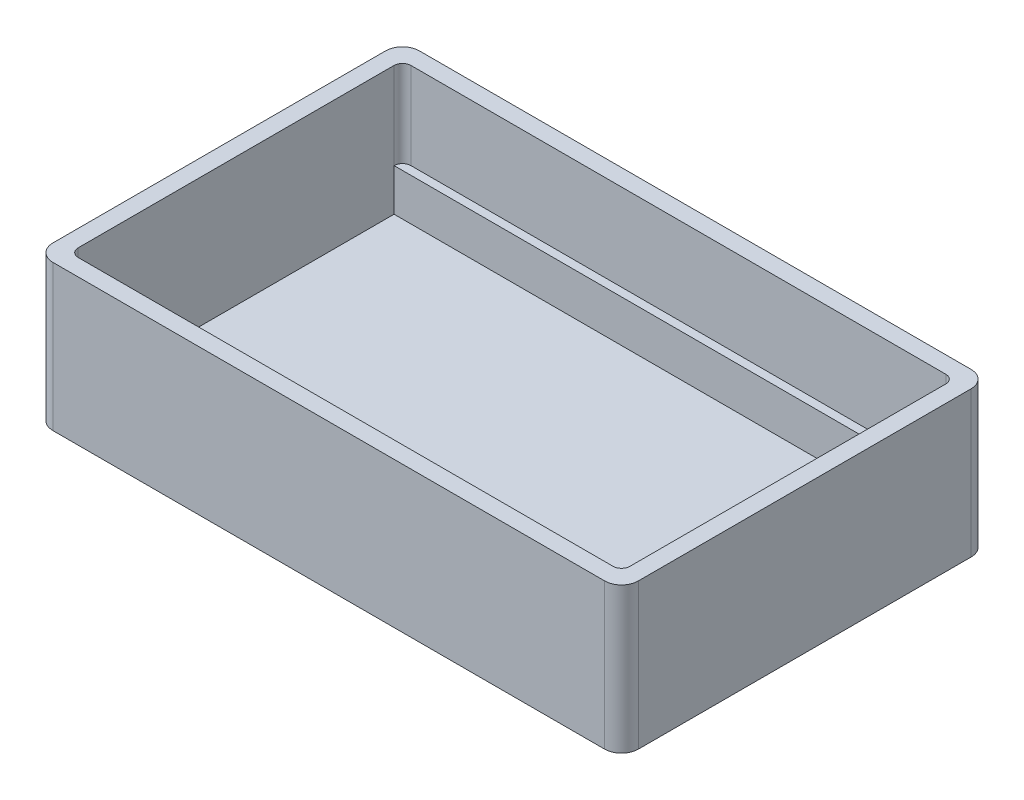
ISO-10303-21;
HEADER;
FILE_DESCRIPTION(('STEP AP214'),'2;1');
FILE_NAME('part.step','',(''),(''),'','','');
FILE_SCHEMA(('AUTOMOTIVE_DESIGN { 1 0 10303 214 1 1 1 1 }'));
ENDSEC;
DATA;
#1=APPLICATION_CONTEXT('core data for automotive mechanical design processes');
#2=APPLICATION_PROTOCOL_DEFINITION('international standard','automotive_design',2000,#1);
#3=PRODUCT_CONTEXT('',#1,'mechanical');
#4=PRODUCT('Part','Part','',(#3));
#5=PRODUCT_RELATED_PRODUCT_CATEGORY('part','',(#4));
#6=PRODUCT_DEFINITION_FORMATION('','',#4);
#7=PRODUCT_DEFINITION_CONTEXT('part definition',#1,'design');
#8=PRODUCT_DEFINITION('design','',#6,#7);
#9=PRODUCT_DEFINITION_SHAPE('','',#8);
#10=(LENGTH_UNIT() NAMED_UNIT(*) SI_UNIT(.MILLI.,.METRE.));
#11=(NAMED_UNIT(*) PLANE_ANGLE_UNIT() SI_UNIT($,.RADIAN.));
#12=(NAMED_UNIT(*) SI_UNIT($,.STERADIAN.) SOLID_ANGLE_UNIT());
#13=UNCERTAINTY_MEASURE_WITH_UNIT(LENGTH_MEASURE(1.E-05),#10,'distance_accuracy_value','');
#14=(GEOMETRIC_REPRESENTATION_CONTEXT(3) GLOBAL_UNCERTAINTY_ASSIGNED_CONTEXT((#13)) GLOBAL_UNIT_ASSIGNED_CONTEXT((#10,
#11,#12)) REPRESENTATION_CONTEXT('',''));
#15=CARTESIAN_POINT('',(0.,0.,0.));
#16=DIRECTION('',(0.,0.,1.));
#17=DIRECTION('',(1.,0.,0.));
#18=AXIS2_PLACEMENT_3D('',#15,#16,#17);
#19=CARTESIAN_POINT('',(92.4170933390066,17.3,19.8786194386804));
#20=DIRECTION('',(1.,0.,0.));
#21=DIRECTION('',(0.,0.,-1.));
#22=AXIS2_PLACEMENT_3D('',#19,#20,#21);
#23=PLANE('',#22);
#24=DIRECTION('',(0.,-1.,0.));
#25=VECTOR('',#24,1.);
#26=CARTESIAN_POINT('',(92.4170933390066,2.,-18.6213805613196));
#27=LINE('',#26,#25);
#28=CARTESIAN_POINT('',(92.4170933390066,17.3,-18.6213805613196));
#29=VERTEX_POINT('',#28);
#30=CARTESIAN_POINT('',(92.4170933390066,7.,-18.6213805613196));
#31=VERTEX_POINT('',#30);
#32=EDGE_CURVE('E232',#29,#31,#27,.T.);
#33=ORIENTED_EDGE('',*,*,#32,.T.);
#34=DIRECTION('',(0.,0.,-1.));
#35=VECTOR('',#34,1.);
#36=CARTESIAN_POINT('',(92.4170933390066,7.,0.));
#37=LINE('',#36,#35);
#38=CARTESIAN_POINT('',(92.4170933390066,7.,18.8786194386804));
#39=VERTEX_POINT('',#38);
#40=EDGE_CURVE('E340',#39,#31,#37,.T.);
#41=ORIENTED_EDGE('',*,*,#40,.F.);
#42=DIRECTION('',(0.,-1.,0.));
#43=VECTOR('',#42,1.);
#44=CARTESIAN_POINT('',(92.4170933390066,17.3,18.8786194386804));
#45=LINE('',#44,#43);
#46=CARTESIAN_POINT('',(92.4170933390066,17.3,18.8786194386804));
#47=VERTEX_POINT('',#46);
#48=EDGE_CURVE('E242',#39,#47,#45,.F.);
#49=ORIENTED_EDGE('',*,*,#48,.T.);
#50=DIRECTION('',(0.,0.,1.));
#51=VECTOR('',#50,1.);
#52=CARTESIAN_POINT('',(92.4170933390066,17.3,19.8786194386804));
#53=LINE('',#52,#51);
#54=EDGE_CURVE('E318',#29,#47,#53,.T.);
#55=ORIENTED_EDGE('',*,*,#54,.F.);
#56=EDGE_LOOP('',(#33,#41,#49,#55));
#57=FACE_BOUND('',#56,.T.);
#58=ADVANCED_FACE('F45',(#57),#23,.F.);
#59=CARTESIAN_POINT('',(92.4170933390066,17.3,-19.6213805613196));
#60=DIRECTION('',(0.,0.,-1.));
#61=DIRECTION('',(-1.,0.,0.));
#62=AXIS2_PLACEMENT_3D('',#59,#60,#61);
#63=PLANE('',#62);
#64=DIRECTION('',(0.,-1.,0.));
#65=VECTOR('',#64,1.);
#66=CARTESIAN_POINT('',(27.9170933390065,2.,-19.6213805613196));
#67=LINE('',#66,#65);
#68=CARTESIAN_POINT('',(27.9170933390065,17.3,-19.6213805613196));
#69=VERTEX_POINT('',#68);
#70=CARTESIAN_POINT('',(27.9170933390065,7.,-19.6213805613196));
#71=VERTEX_POINT('',#70);
#72=EDGE_CURVE('E223',#69,#71,#67,.T.);
#73=ORIENTED_EDGE('',*,*,#72,.T.);
#74=DIRECTION('',(-1.,0.,0.));
#75=VECTOR('',#74,1.);
#76=CARTESIAN_POINT('',(0.,7.,-19.6213805613196));
#77=LINE('',#76,#75);
#78=CARTESIAN_POINT('',(91.4170933390066,7.,-19.6213805613196));
#79=VERTEX_POINT('',#78);
#80=EDGE_CURVE('E336',#79,#71,#77,.T.);
#81=ORIENTED_EDGE('',*,*,#80,.F.);
#82=DIRECTION('',(0.,-1.,0.));
#83=VECTOR('',#82,1.);
#84=CARTESIAN_POINT('',(91.4170933390066,17.3,-19.6213805613196));
#85=LINE('',#84,#83);
#86=CARTESIAN_POINT('',(91.4170933390066,17.3,-19.6213805613196));
#87=VERTEX_POINT('',#86);
#88=EDGE_CURVE('E235',#79,#87,#85,.F.);
#89=ORIENTED_EDGE('',*,*,#88,.T.);
#90=DIRECTION('',(1.,0.,0.));
#91=VECTOR('',#90,1.);
#92=CARTESIAN_POINT('',(92.4170933390066,17.3,-19.6213805613196));
#93=LINE('',#92,#91);
#94=EDGE_CURVE('E307',#69,#87,#93,.T.);
#95=ORIENTED_EDGE('',*,*,#94,.F.);
#96=EDGE_LOOP('',(#73,#81,#89,#95));
#97=FACE_BOUND('',#96,.T.);
#98=ADVANCED_FACE('F366',(#97),#63,.F.);
#99=CARTESIAN_POINT('',(26.9170933390065,17.3,19.8786194386804));
#100=DIRECTION('',(-1.,0.,0.));
#101=DIRECTION('',(0.,0.,1.));
#102=AXIS2_PLACEMENT_3D('',#99,#100,#101);
#103=PLANE('',#102);
#104=DIRECTION('',(0.,0.,1.));
#105=VECTOR('',#104,1.);
#106=CARTESIAN_POINT('',(26.9170933390065,2.,19.8786194386804));
#107=LINE('',#106,#105);
#108=CARTESIAN_POINT('',(26.9170933390065,2.,-18.6213805613196));
#109=VERTEX_POINT('',#108);
#110=CARTESIAN_POINT('',(26.9170933390065,2.,18.8786194386804));
#111=VERTEX_POINT('',#110);
#112=EDGE_CURVE('E189',#109,#111,#107,.T.);
#113=ORIENTED_EDGE('',*,*,#112,.F.);
#114=DIRECTION('',(0.,-1.,0.));
#115=VECTOR('',#114,1.);
#116=CARTESIAN_POINT('',(26.9170933390065,17.3,-18.6213805613196));
#117=LINE('',#116,#115);
#118=CARTESIAN_POINT('',(26.9170933390065,7.,-18.6213805613196));
#119=VERTEX_POINT('',#118);
#120=EDGE_CURVE('E227',#109,#119,#117,.F.);
#121=ORIENTED_EDGE('',*,*,#120,.T.);
#122=CARTESIAN_POINT('',(26.9170933390065,17.3,-18.6213805613196));
#123=VERTEX_POINT('',#122);
#124=EDGE_CURVE('E226',#119,#123,#117,.F.);
#125=ORIENTED_EDGE('',*,*,#124,.T.);
#126=DIRECTION('',(0.,0.,-1.));
#127=VECTOR('',#126,1.);
#128=CARTESIAN_POINT('',(26.9170933390065,17.3,19.8786194386804));
#129=LINE('',#128,#127);
#130=CARTESIAN_POINT('',(26.9170933390065,17.3,18.8786194386804));
#131=VERTEX_POINT('',#130);
#132=EDGE_CURVE('E210',#131,#123,#129,.T.);
#133=ORIENTED_EDGE('',*,*,#132,.F.);
#134=DIRECTION('',(0.,-1.,0.));
#135=VECTOR('',#134,1.);
#136=CARTESIAN_POINT('',(26.9170933390065,2.,18.8786194386804));
#137=LINE('',#136,#135);
#138=CARTESIAN_POINT('',(26.9170933390065,7.,18.8786194386804));
#139=VERTEX_POINT('',#138);
#140=EDGE_CURVE('E204',#131,#139,#137,.T.);
#141=ORIENTED_EDGE('',*,*,#140,.T.);
#142=DIRECTION('',(0.,-1.,0.));
#143=VECTOR('',#142,1.);
#144=CARTESIAN_POINT('',(26.9170933390065,7.,18.8786194386804));
#145=LINE('',#144,#143);
#146=EDGE_CURVE('E178',#139,#111,#145,.T.);
#147=ORIENTED_EDGE('',*,*,#146,.T.);
#148=EDGE_LOOP('',(#113,#121,#125,#133,#141,#147));
#149=FACE_BOUND('',#148,.T.);
#150=ADVANCED_FACE('F208',(#149),#103,.F.);
#151=CARTESIAN_POINT('',(92.4170933390066,17.3,19.8786194386804));
#152=DIRECTION('',(0.,0.,1.));
#153=DIRECTION('',(1.,0.,0.));
#154=AXIS2_PLACEMENT_3D('',#151,#152,#153);
#155=PLANE('',#154);
#156=DIRECTION('',(0.,-1.,0.));
#157=VECTOR('',#156,1.);
#158=CARTESIAN_POINT('',(91.4170933390066,2.,19.8786194386804));
#159=LINE('',#158,#157);
#160=CARTESIAN_POINT('',(91.4170933390066,17.3,19.8786194386804));
#161=VERTEX_POINT('',#160);
#162=CARTESIAN_POINT('',(91.4170933390066,7.,19.8786194386804));
#163=VERTEX_POINT('',#162);
#164=EDGE_CURVE('E239',#161,#163,#159,.T.);
#165=ORIENTED_EDGE('',*,*,#164,.T.);
#166=DIRECTION('',(1.,0.,0.));
#167=VECTOR('',#166,1.);
#168=CARTESIAN_POINT('',(0.,7.,19.8786194386804));
#169=LINE('',#168,#167);
#170=CARTESIAN_POINT('',(27.9170933390065,7.,19.8786194386804));
#171=VERTEX_POINT('',#170);
#172=EDGE_CURVE('E60',#171,#163,#169,.T.);
#173=ORIENTED_EDGE('',*,*,#172,.F.);
#174=DIRECTION('',(0.,-1.,0.));
#175=VECTOR('',#174,1.);
#176=CARTESIAN_POINT('',(27.9170933390065,17.3,19.8786194386804));
#177=LINE('',#176,#175);
#178=CARTESIAN_POINT('',(27.9170933390065,17.3,19.8786194386804));
#179=VERTEX_POINT('',#178);
#180=EDGE_CURVE('E205',#171,#179,#177,.F.);
#181=ORIENTED_EDGE('',*,*,#180,.T.);
#182=DIRECTION('',(-1.,0.,0.));
#183=VECTOR('',#182,1.);
#184=CARTESIAN_POINT('',(92.4170933390066,17.3,19.8786194386804));
#185=LINE('',#184,#183);
#186=EDGE_CURVE('E315',#161,#179,#185,.T.);
#187=ORIENTED_EDGE('',*,*,#186,.F.);
#188=EDGE_LOOP('',(#165,#173,#181,#187));
#189=FACE_BOUND('',#188,.T.);
#190=ADVANCED_FACE('F357',(#189),#155,.F.);
#191=CARTESIAN_POINT('',(94.4170933390066,17.3,21.8786194386804));
#192=DIRECTION('',(0.,0.,1.));
#193=DIRECTION('',(1.,0.,0.));
#194=AXIS2_PLACEMENT_3D('',#191,#192,#193);
#195=PLANE('',#194);
#196=DIRECTION('',(-1.,0.,0.));
#197=VECTOR('',#196,1.);
#198=CARTESIAN_POINT('',(94.4170933390066,17.3,21.8786194386804));
#199=LINE('',#198,#197);
#200=CARTESIAN_POINT('',(92.4170933390066,17.3,21.8786194386804));
#201=VERTEX_POINT('',#200);
#202=CARTESIAN_POINT('',(26.9170933390065,17.3,21.8786194386804));
#203=VERTEX_POINT('',#202);
#204=EDGE_CURVE('E281',#201,#203,#199,.T.);
#205=ORIENTED_EDGE('',*,*,#204,.T.);
#206=DIRECTION('',(0.,-1.,0.));
#207=VECTOR('',#206,1.);
#208=CARTESIAN_POINT('',(26.9170933390065,17.3,21.8786194386804));
#209=LINE('',#208,#207);
#210=CARTESIAN_POINT('',(26.9170933390065,0.,21.8786194386804));
#211=VERTEX_POINT('',#210);
#212=EDGE_CURVE('E11',#203,#211,#209,.T.);
#213=ORIENTED_EDGE('',*,*,#212,.T.);
#214=DIRECTION('',(-1.,0.,0.));
#215=VECTOR('',#214,1.);
#216=CARTESIAN_POINT('',(94.4170933390066,0.,21.8786194386804));
#217=LINE('',#216,#215);
#218=CARTESIAN_POINT('',(92.4170933390066,0.,21.8786194386804));
#219=VERTEX_POINT('',#218);
#220=EDGE_CURVE('E284',#219,#211,#217,.T.);
#221=ORIENTED_EDGE('',*,*,#220,.F.);
#222=DIRECTION('',(0.,-1.,0.));
#223=VECTOR('',#222,1.);
#224=CARTESIAN_POINT('',(92.4170933390066,17.3,21.8786194386804));
#225=LINE('',#224,#223);
#226=EDGE_CURVE('E53',#219,#201,#225,.F.);
#227=ORIENTED_EDGE('',*,*,#226,.T.);
#228=EDGE_LOOP('',(#205,#213,#221,#227));
#229=FACE_BOUND('',#228,.T.);
#230=ADVANCED_FACE('F280',(#229),#195,.T.);
#231=CARTESIAN_POINT('',(94.4170933390066,17.3,21.8786194386804));
#232=DIRECTION('',(1.,0.,0.));
#233=DIRECTION('',(0.,0.,-1.));
#234=AXIS2_PLACEMENT_3D('',#231,#232,#233);
#235=PLANE('',#234);
#236=DIRECTION('',(0.,0.,1.));
#237=VECTOR('',#236,1.);
#238=CARTESIAN_POINT('',(94.4170933390066,0.,21.8786194386804));
#239=LINE('',#238,#237);
#240=CARTESIAN_POINT('',(94.4170933390066,0.,-19.6213805613196));
#241=VERTEX_POINT('',#240);
#242=CARTESIAN_POINT('',(94.4170933390066,0.,19.8786194386804));
#243=VERTEX_POINT('',#242);
#244=EDGE_CURVE('E219',#241,#243,#239,.T.);
#245=ORIENTED_EDGE('',*,*,#244,.F.);
#246=DIRECTION('',(0.,-1.,0.));
#247=VECTOR('',#246,1.);
#248=CARTESIAN_POINT('',(94.4170933390066,17.3,-19.6213805613196));
#249=LINE('',#248,#247);
#250=CARTESIAN_POINT('',(94.4170933390066,17.3,-19.6213805613196));
#251=VERTEX_POINT('',#250);
#252=EDGE_CURVE('E262',#241,#251,#249,.F.);
#253=ORIENTED_EDGE('',*,*,#252,.T.);
#254=DIRECTION('',(0.,0.,1.));
#255=VECTOR('',#254,1.);
#256=CARTESIAN_POINT('',(94.4170933390066,17.3,21.8786194386804));
#257=LINE('',#256,#255);
#258=CARTESIAN_POINT('',(94.4170933390066,17.3,19.8786194386804));
#259=VERTEX_POINT('',#258);
#260=EDGE_CURVE('E211',#251,#259,#257,.T.);
#261=ORIENTED_EDGE('',*,*,#260,.T.);
#262=DIRECTION('',(0.,-1.,0.));
#263=VECTOR('',#262,1.);
#264=CARTESIAN_POINT('',(94.4170933390066,17.3,19.8786194386804));
#265=LINE('',#264,#263);
#266=EDGE_CURVE('E259',#259,#243,#265,.T.);
#267=ORIENTED_EDGE('',*,*,#266,.T.);
#268=EDGE_LOOP('',(#245,#253,#261,#267));
#269=FACE_BOUND('',#268,.T.);
#270=ADVANCED_FACE('F296',(#269),#235,.T.);
#271=CARTESIAN_POINT('',(94.4170933390066,17.3,-21.6213805613196));
#272=DIRECTION('',(0.,0.,-1.));
#273=DIRECTION('',(-1.,0.,0.));
#274=AXIS2_PLACEMENT_3D('',#271,#272,#273);
#275=PLANE('',#274);
#276=DIRECTION('',(1.,0.,0.));
#277=VECTOR('',#276,1.);
#278=CARTESIAN_POINT('',(94.4170933390066,17.3,-21.6213805613196));
#279=LINE('',#278,#277);
#280=CARTESIAN_POINT('',(26.9170933390065,17.3,-21.6213805613196));
#281=VERTEX_POINT('',#280);
#282=CARTESIAN_POINT('',(92.4170933390066,17.3,-21.6213805613196));
#283=VERTEX_POINT('',#282);
#284=EDGE_CURVE('E216',#281,#283,#279,.T.);
#285=ORIENTED_EDGE('',*,*,#284,.T.);
#286=DIRECTION('',(0.,-1.,0.));
#287=VECTOR('',#286,1.);
#288=CARTESIAN_POINT('',(92.4170933390066,17.3,-21.6213805613196));
#289=LINE('',#288,#287);
#290=CARTESIAN_POINT('',(92.4170933390066,0.,-21.6213805613196));
#291=VERTEX_POINT('',#290);
#292=EDGE_CURVE('E248',#283,#291,#289,.T.);
#293=ORIENTED_EDGE('',*,*,#292,.T.);
#294=DIRECTION('',(1.,0.,0.));
#295=VECTOR('',#294,1.);
#296=CARTESIAN_POINT('',(94.4170933390066,0.,-21.6213805613196));
#297=LINE('',#296,#295);
#298=CARTESIAN_POINT('',(26.9170933390065,0.,-21.6213805613196));
#299=VERTEX_POINT('',#298);
#300=EDGE_CURVE('E301',#299,#291,#297,.T.);
#301=ORIENTED_EDGE('',*,*,#300,.F.);
#302=DIRECTION('',(0.,-1.,0.));
#303=VECTOR('',#302,1.);
#304=CARTESIAN_POINT('',(26.9170933390065,17.3,-21.6213805613196));
#305=LINE('',#304,#303);
#306=EDGE_CURVE('E246',#299,#281,#305,.F.);
#307=ORIENTED_EDGE('',*,*,#306,.T.);
#308=EDGE_LOOP('',(#285,#293,#301,#307));
#309=FACE_BOUND('',#308,.T.);
#310=ADVANCED_FACE('F385',(#309),#275,.T.);
#311=CARTESIAN_POINT('',(24.9170933390065,17.3,21.8786194386804));
#312=DIRECTION('',(-1.,0.,0.));
#313=DIRECTION('',(0.,0.,1.));
#314=AXIS2_PLACEMENT_3D('',#311,#312,#313);
#315=PLANE('',#314);
#316=DIRECTION('',(0.,0.,-1.));
#317=VECTOR('',#316,1.);
#318=CARTESIAN_POINT('',(24.9170933390065,17.3,21.8786194386804));
#319=LINE('',#318,#317);
#320=CARTESIAN_POINT('',(24.9170933390065,17.3,19.8786194386804));
#321=VERTEX_POINT('',#320);
#322=CARTESIAN_POINT('',(24.9170933390066,17.3,-19.6213805613196));
#323=VERTEX_POINT('',#322);
#324=EDGE_CURVE('E290',#321,#323,#319,.T.);
#325=ORIENTED_EDGE('',*,*,#324,.T.);
#326=DIRECTION('',(0.,-1.,0.));
#327=VECTOR('',#326,1.);
#328=CARTESIAN_POINT('',(24.9170933390066,17.3,-19.6213805613196));
#329=LINE('',#328,#327);
#330=CARTESIAN_POINT('',(24.9170933390066,0.,-19.6213805613196));
#331=VERTEX_POINT('',#330);
#332=EDGE_CURVE('E273',#323,#331,#329,.T.);
#333=ORIENTED_EDGE('',*,*,#332,.T.);
#334=DIRECTION('',(0.,0.,-1.));
#335=VECTOR('',#334,1.);
#336=CARTESIAN_POINT('',(24.9170933390065,0.,21.8786194386804));
#337=LINE('',#336,#335);
#338=CARTESIAN_POINT('',(24.9170933390065,0.,19.8786194386804));
#339=VERTEX_POINT('',#338);
#340=EDGE_CURVE('E302',#339,#331,#337,.T.);
#341=ORIENTED_EDGE('',*,*,#340,.F.);
#342=DIRECTION('',(0.,-1.,0.));
#343=VECTOR('',#342,1.);
#344=CARTESIAN_POINT('',(24.9170933390065,17.3,19.8786194386804));
#345=LINE('',#344,#343);
#346=EDGE_CURVE('E271',#339,#321,#345,.F.);
#347=ORIENTED_EDGE('',*,*,#346,.T.);
#348=EDGE_LOOP('',(#325,#333,#341,#347));
#349=FACE_BOUND('',#348,.T.);
#350=ADVANCED_FACE('F379',(#349),#315,.T.);
#351=CARTESIAN_POINT('',(0.,17.3,0.));
#352=DIRECTION('',(0.,-1.,0.));
#353=DIRECTION('',(0.,0.,-1.));
#354=AXIS2_PLACEMENT_3D('',#351,#352,#353);
#355=PLANE('',#354);
#356=ORIENTED_EDGE('',*,*,#132,.T.);
#357=CARTESIAN_POINT('',(27.9170933390065,17.3,-18.6213805613196));
#358=DIRECTION('',(0.,-1.,0.));
#359=DIRECTION('',(0.,0.,-1.));
#360=AXIS2_PLACEMENT_3D('',#357,#358,#359);
#361=CIRCLE('',#360,1.);
#362=EDGE_CURVE('E230',#123,#69,#361,.T.);
#363=ORIENTED_EDGE('',*,*,#362,.T.);
#364=ORIENTED_EDGE('',*,*,#94,.T.);
#365=CARTESIAN_POINT('',(91.4170933390066,17.3,-18.6213805613196));
#366=DIRECTION('',(0.,-1.,0.));
#367=DIRECTION('',(0.,0.,-1.));
#368=AXIS2_PLACEMENT_3D('',#365,#366,#367);
#369=CIRCLE('',#368,1.);
#370=EDGE_CURVE('E237',#87,#29,#369,.T.);
#371=ORIENTED_EDGE('',*,*,#370,.T.);
#372=ORIENTED_EDGE('',*,*,#54,.T.);
#373=CARTESIAN_POINT('',(91.4170933390066,17.3,18.8786194386804));
#374=DIRECTION('',(0.,-1.,0.));
#375=DIRECTION('',(0.,0.,-1.));
#376=AXIS2_PLACEMENT_3D('',#373,#374,#375);
#377=CIRCLE('',#376,1.);
#378=EDGE_CURVE('E244',#47,#161,#377,.T.);
#379=ORIENTED_EDGE('',*,*,#378,.T.);
#380=ORIENTED_EDGE('',*,*,#186,.T.);
#381=CARTESIAN_POINT('',(27.9170933390065,17.3,18.8786194386804));
#382=DIRECTION('',(0.,-1.,0.));
#383=DIRECTION('',(0.,0.,-1.));
#384=AXIS2_PLACEMENT_3D('',#381,#382,#383);
#385=CIRCLE('',#384,1.);
#386=EDGE_CURVE('E213',#179,#131,#385,.T.);
#387=ORIENTED_EDGE('',*,*,#386,.T.);
#388=EDGE_LOOP('',(#356,#363,#364,#371,#372,#379,#380,#387));
#389=FACE_BOUND('',#388,.T.);
#390=ORIENTED_EDGE('',*,*,#260,.F.);
#391=CARTESIAN_POINT('',(92.4170933390066,17.3,-19.6213805613196));
#392=DIRECTION('',(0.,-1.,0.));
#393=DIRECTION('',(0.,0.,-1.));
#394=AXIS2_PLACEMENT_3D('',#391,#392,#393);
#395=CIRCLE('',#394,2.);
#396=EDGE_CURVE('E269',#251,#283,#395,.F.);
#397=ORIENTED_EDGE('',*,*,#396,.T.);
#398=ORIENTED_EDGE('',*,*,#284,.F.);
#399=CARTESIAN_POINT('',(26.9170933390066,17.3,-19.6213805613196));
#400=DIRECTION('',(0.,-1.,0.));
#401=DIRECTION('',(0.,0.,-1.));
#402=AXIS2_PLACEMENT_3D('',#399,#400,#401);
#403=CIRCLE('',#402,2.);
#404=EDGE_CURVE('E68',#281,#323,#403,.F.);
#405=ORIENTED_EDGE('',*,*,#404,.T.);
#406=ORIENTED_EDGE('',*,*,#324,.F.);
#407=CARTESIAN_POINT('',(26.9170933390065,17.3,19.8786194386804));
#408=DIRECTION('',(0.,-1.,0.));
#409=DIRECTION('',(0.,0.,-1.));
#410=AXIS2_PLACEMENT_3D('',#407,#408,#409);
#411=CIRCLE('',#410,2.);
#412=EDGE_CURVE('E266',#321,#203,#411,.F.);
#413=ORIENTED_EDGE('',*,*,#412,.T.);
#414=ORIENTED_EDGE('',*,*,#204,.F.);
#415=CARTESIAN_POINT('',(92.4170933390066,17.3,19.8786194386804));
#416=DIRECTION('',(0.,-1.,0.));
#417=DIRECTION('',(0.,0.,-1.));
#418=AXIS2_PLACEMENT_3D('',#415,#416,#417);
#419=CIRCLE('',#418,2.);
#420=EDGE_CURVE('E264',#201,#259,#419,.F.);
#421=ORIENTED_EDGE('',*,*,#420,.T.);
#422=EDGE_LOOP('',(#390,#397,#398,#405,#406,#413,#414,#421));
#423=FACE_BOUND('',#422,.T.);
#424=ADVANCED_FACE('F288',(#389,#423),#355,.F.);
#425=CARTESIAN_POINT('',(0.,0.,0.));
#426=DIRECTION('',(0.,-1.,0.));
#427=DIRECTION('',(0.,0.,-1.));
#428=AXIS2_PLACEMENT_3D('',#425,#426,#427);
#429=PLANE('',#428);
#430=ORIENTED_EDGE('',*,*,#300,.T.);
#431=CARTESIAN_POINT('',(92.4170933390066,0.,-19.6213805613196));
#432=DIRECTION('',(0.,-1.,0.));
#433=DIRECTION('',(0.,0.,-1.));
#434=AXIS2_PLACEMENT_3D('',#431,#432,#433);
#435=CIRCLE('',#434,2.);
#436=EDGE_CURVE('E257',#291,#241,#435,.T.);
#437=ORIENTED_EDGE('',*,*,#436,.T.);
#438=ORIENTED_EDGE('',*,*,#244,.T.);
#439=CARTESIAN_POINT('',(92.4170933390066,0.,19.8786194386804));
#440=DIRECTION('',(0.,-1.,0.));
#441=DIRECTION('',(0.,0.,-1.));
#442=AXIS2_PLACEMENT_3D('',#439,#440,#441);
#443=CIRCLE('',#442,2.);
#444=EDGE_CURVE('E251',#243,#219,#443,.T.);
#445=ORIENTED_EDGE('',*,*,#444,.T.);
#446=ORIENTED_EDGE('',*,*,#220,.T.);
#447=CARTESIAN_POINT('',(26.9170933390065,0.,19.8786194386804));
#448=DIRECTION('',(0.,-1.,0.));
#449=DIRECTION('',(0.,0.,-1.));
#450=AXIS2_PLACEMENT_3D('',#447,#448,#449);
#451=CIRCLE('',#450,2.);
#452=EDGE_CURVE('E253',#211,#339,#451,.T.);
#453=ORIENTED_EDGE('',*,*,#452,.T.);
#454=ORIENTED_EDGE('',*,*,#340,.T.);
#455=CARTESIAN_POINT('',(26.9170933390066,0.,-19.6213805613196));
#456=DIRECTION('',(0.,-1.,0.));
#457=DIRECTION('',(0.,0.,-1.));
#458=AXIS2_PLACEMENT_3D('',#455,#456,#457);
#459=CIRCLE('',#458,2.);
#460=EDGE_CURVE('E255',#331,#299,#459,.T.);
#461=ORIENTED_EDGE('',*,*,#460,.T.);
#462=EDGE_LOOP('',(#430,#437,#438,#445,#446,#453,#454,#461));
#463=FACE_BOUND('',#462,.T.);
#464=ADVANCED_FACE('F300',(#463),#429,.T.);
#465=CARTESIAN_POINT('',(0.,2.,0.));
#466=DIRECTION('',(0.,-1.,0.));
#467=DIRECTION('',(0.,0.,-1.));
#468=AXIS2_PLACEMENT_3D('',#465,#466,#467);
#469=PLANE('',#468);
#470=ORIENTED_EDGE('',*,*,#112,.T.);
#471=DIRECTION('',(1.,0.,0.));
#472=VECTOR('',#471,1.);
#473=CARTESIAN_POINT('',(0.,2.,18.8786194386804));
#474=LINE('',#473,#472);
#475=CARTESIAN_POINT('',(87.4170933390065,2.,18.8786194386804));
#476=VERTEX_POINT('',#475);
#477=EDGE_CURVE('E184',#111,#476,#474,.T.);
#478=ORIENTED_EDGE('',*,*,#477,.T.);
#479=DIRECTION('',(0.,0.,-1.));
#480=VECTOR('',#479,1.);
#481=CARTESIAN_POINT('',(87.4170933390065,2.,0.));
#482=LINE('',#481,#480);
#483=CARTESIAN_POINT('',(87.4170933390065,2.,-18.6213805613196));
#484=VERTEX_POINT('',#483);
#485=EDGE_CURVE('E197',#476,#484,#482,.T.);
#486=ORIENTED_EDGE('',*,*,#485,.T.);
#487=DIRECTION('',(1.,0.,0.));
#488=VECTOR('',#487,1.);
#489=CARTESIAN_POINT('',(0.,2.,-18.6213805613196));
#490=LINE('',#489,#488);
#491=EDGE_CURVE('E327',#109,#484,#490,.T.);
#492=ORIENTED_EDGE('',*,*,#491,.F.);
#493=EDGE_LOOP('',(#470,#478,#486,#492));
#494=FACE_BOUND('',#493,.T.);
#495=ADVANCED_FACE('F382',(#494),#469,.F.);
#496=CARTESIAN_POINT('',(27.9170933390065,17.3,18.8786194386804));
#497=DIRECTION('',(0.,1.,0.));
#498=DIRECTION('',(0.,0.,1.));
#499=AXIS2_PLACEMENT_3D('',#496,#497,#498);
#500=CYLINDRICAL_SURFACE('',#499,1.);
#501=ORIENTED_EDGE('',*,*,#180,.F.);
#502=CARTESIAN_POINT('',(27.9170933390065,7.,18.8786194386804));
#503=DIRECTION('',(0.,1.,0.));
#504=DIRECTION('',(0.,0.,1.));
#505=AXIS2_PLACEMENT_3D('',#502,#503,#504);
#506=CIRCLE('',#505,1.);
#507=EDGE_CURVE('E194',#139,#171,#506,.T.);
#508=ORIENTED_EDGE('',*,*,#507,.F.);
#509=ORIENTED_EDGE('',*,*,#140,.F.);
#510=ORIENTED_EDGE('',*,*,#386,.F.);
#511=EDGE_LOOP('',(#501,#508,#509,#510));
#512=FACE_BOUND('',#511,.T.);
#513=ADVANCED_FACE('F202',(#512),#500,.F.);
#514=CARTESIAN_POINT('',(27.9170933390065,17.3,-18.6213805613196));
#515=DIRECTION('',(0.,1.,0.));
#516=DIRECTION('',(0.,0.,1.));
#517=AXIS2_PLACEMENT_3D('',#514,#515,#516);
#518=CYLINDRICAL_SURFACE('',#517,1.);
#519=ORIENTED_EDGE('',*,*,#124,.F.);
#520=CARTESIAN_POINT('',(27.9170933390065,7.,-18.6213805613196));
#521=DIRECTION('',(0.,1.,0.));
#522=DIRECTION('',(0.,0.,1.));
#523=AXIS2_PLACEMENT_3D('',#520,#521,#522);
#524=CIRCLE('',#523,1.);
#525=EDGE_CURVE('E334',#71,#119,#524,.T.);
#526=ORIENTED_EDGE('',*,*,#525,.F.);
#527=ORIENTED_EDGE('',*,*,#72,.F.);
#528=ORIENTED_EDGE('',*,*,#362,.F.);
#529=EDGE_LOOP('',(#519,#526,#527,#528));
#530=FACE_BOUND('',#529,.T.);
#531=ADVANCED_FACE('F394',(#530),#518,.F.);
#532=CARTESIAN_POINT('',(91.4170933390066,17.3,-18.6213805613196));
#533=DIRECTION('',(0.,1.,0.));
#534=DIRECTION('',(0.,0.,1.));
#535=AXIS2_PLACEMENT_3D('',#532,#533,#534);
#536=CYLINDRICAL_SURFACE('',#535,1.);
#537=ORIENTED_EDGE('',*,*,#88,.F.);
#538=CARTESIAN_POINT('',(91.4170933390066,7.,-18.6213805613196));
#539=DIRECTION('',(0.,1.,0.));
#540=DIRECTION('',(0.,0.,1.));
#541=AXIS2_PLACEMENT_3D('',#538,#539,#540);
#542=CIRCLE('',#541,1.);
#543=EDGE_CURVE('E338',#31,#79,#542,.T.);
#544=ORIENTED_EDGE('',*,*,#543,.F.);
#545=ORIENTED_EDGE('',*,*,#32,.F.);
#546=ORIENTED_EDGE('',*,*,#370,.F.);
#547=EDGE_LOOP('',(#537,#544,#545,#546));
#548=FACE_BOUND('',#547,.T.);
#549=ADVANCED_FACE('F397',(#548),#536,.F.);
#550=CARTESIAN_POINT('',(91.4170933390066,17.3,18.8786194386804));
#551=DIRECTION('',(0.,1.,0.));
#552=DIRECTION('',(0.,0.,1.));
#553=AXIS2_PLACEMENT_3D('',#550,#551,#552);
#554=CYLINDRICAL_SURFACE('',#553,1.);
#555=ORIENTED_EDGE('',*,*,#48,.F.);
#556=CARTESIAN_POINT('',(91.4170933390066,7.,18.8786194386804));
#557=DIRECTION('',(0.,1.,0.));
#558=DIRECTION('',(0.,0.,1.));
#559=AXIS2_PLACEMENT_3D('',#556,#557,#558);
#560=CIRCLE('',#559,1.);
#561=EDGE_CURVE('E342',#163,#39,#560,.T.);
#562=ORIENTED_EDGE('',*,*,#561,.F.);
#563=ORIENTED_EDGE('',*,*,#164,.F.);
#564=ORIENTED_EDGE('',*,*,#378,.F.);
#565=EDGE_LOOP('',(#555,#562,#563,#564));
#566=FACE_BOUND('',#565,.T.);
#567=ADVANCED_FACE('F353',(#566),#554,.F.);
#568=CARTESIAN_POINT('',(92.4170933390066,17.3,-19.6213805613196));
#569=DIRECTION('',(0.,-1.,0.));
#570=DIRECTION('',(0.,0.,-1.));
#571=AXIS2_PLACEMENT_3D('',#568,#569,#570);
#572=CYLINDRICAL_SURFACE('',#571,2.);
#573=ORIENTED_EDGE('',*,*,#396,.F.);
#574=ORIENTED_EDGE('',*,*,#252,.F.);
#575=ORIENTED_EDGE('',*,*,#436,.F.);
#576=ORIENTED_EDGE('',*,*,#292,.F.);
#577=EDGE_LOOP('',(#573,#574,#575,#576));
#578=FACE_BOUND('',#577,.T.);
#579=ADVANCED_FACE('F404',(#578),#572,.T.);
#580=CARTESIAN_POINT('',(26.9170933390066,17.3,-19.6213805613196));
#581=DIRECTION('',(0.,-1.,0.));
#582=DIRECTION('',(0.,0.,-1.));
#583=AXIS2_PLACEMENT_3D('',#580,#581,#582);
#584=CYLINDRICAL_SURFACE('',#583,2.);
#585=ORIENTED_EDGE('',*,*,#404,.F.);
#586=ORIENTED_EDGE('',*,*,#306,.F.);
#587=ORIENTED_EDGE('',*,*,#460,.F.);
#588=ORIENTED_EDGE('',*,*,#332,.F.);
#589=EDGE_LOOP('',(#585,#586,#587,#588));
#590=FACE_BOUND('',#589,.T.);
#591=ADVANCED_FACE('F407',(#590),#584,.T.);
#592=CARTESIAN_POINT('',(26.9170933390065,17.3,19.8786194386804));
#593=DIRECTION('',(0.,-1.,0.));
#594=DIRECTION('',(0.,0.,-1.));
#595=AXIS2_PLACEMENT_3D('',#592,#593,#594);
#596=CYLINDRICAL_SURFACE('',#595,2.);
#597=ORIENTED_EDGE('',*,*,#412,.F.);
#598=ORIENTED_EDGE('',*,*,#346,.F.);
#599=ORIENTED_EDGE('',*,*,#452,.F.);
#600=ORIENTED_EDGE('',*,*,#212,.F.);
#601=EDGE_LOOP('',(#597,#598,#599,#600));
#602=FACE_BOUND('',#601,.T.);
#603=ADVANCED_FACE('F410',(#602),#596,.T.);
#604=CARTESIAN_POINT('',(92.4170933390066,17.3,19.8786194386804));
#605=DIRECTION('',(0.,-1.,0.));
#606=DIRECTION('',(0.,0.,-1.));
#607=AXIS2_PLACEMENT_3D('',#604,#605,#606);
#608=CYLINDRICAL_SURFACE('',#607,2.);
#609=ORIENTED_EDGE('',*,*,#420,.F.);
#610=ORIENTED_EDGE('',*,*,#226,.F.);
#611=ORIENTED_EDGE('',*,*,#444,.F.);
#612=ORIENTED_EDGE('',*,*,#266,.F.);
#613=EDGE_LOOP('',(#609,#610,#611,#612));
#614=FACE_BOUND('',#613,.T.);
#615=ADVANCED_FACE('F47',(#614),#608,.T.);
#616=CARTESIAN_POINT('',(0.,7.,18.8786194386804));
#617=DIRECTION('',(0.,0.,-1.));
#618=DIRECTION('',(-1.,0.,0.));
#619=AXIS2_PLACEMENT_3D('',#616,#617,#618);
#620=PLANE('',#619);
#621=ORIENTED_EDGE('',*,*,#477,.F.);
#622=ORIENTED_EDGE('',*,*,#146,.F.);
#623=DIRECTION('',(1.,0.,0.));
#624=VECTOR('',#623,1.);
#625=CARTESIAN_POINT('',(0.,7.,18.8786194386804));
#626=LINE('',#625,#624);
#627=CARTESIAN_POINT('',(87.4170933390065,7.,18.8786194386804));
#628=VERTEX_POINT('',#627);
#629=EDGE_CURVE('E181',#139,#628,#626,.T.);
#630=ORIENTED_EDGE('',*,*,#629,.T.);
#631=DIRECTION('',(0.,-1.,0.));
#632=VECTOR('',#631,1.);
#633=CARTESIAN_POINT('',(87.4170933390065,7.,18.8786194386804));
#634=LINE('',#633,#632);
#635=EDGE_CURVE('E323',#628,#476,#634,.T.);
#636=ORIENTED_EDGE('',*,*,#635,.T.);
#637=EDGE_LOOP('',(#621,#622,#630,#636));
#638=FACE_BOUND('',#637,.T.);
#639=ADVANCED_FACE('F180',(#638),#620,.T.);
#640=CARTESIAN_POINT('',(0.,7.,-18.6213805613196));
#641=DIRECTION('',(0.,0.,-1.));
#642=DIRECTION('',(-1.,0.,0.));
#643=AXIS2_PLACEMENT_3D('',#640,#641,#642);
#644=PLANE('',#643);
#645=ORIENTED_EDGE('',*,*,#491,.T.);
#646=DIRECTION('',(0.,-1.,0.));
#647=VECTOR('',#646,1.);
#648=CARTESIAN_POINT('',(87.4170933390065,7.,-18.6213805613196));
#649=LINE('',#648,#647);
#650=CARTESIAN_POINT('',(87.4170933390065,7.,-18.6213805613196));
#651=VERTEX_POINT('',#650);
#652=EDGE_CURVE('E190',#651,#484,#649,.T.);
#653=ORIENTED_EDGE('',*,*,#652,.F.);
#654=DIRECTION('',(1.,0.,0.));
#655=VECTOR('',#654,1.);
#656=CARTESIAN_POINT('',(0.,7.,-18.6213805613196));
#657=LINE('',#656,#655);
#658=EDGE_CURVE('E332',#119,#651,#657,.T.);
#659=ORIENTED_EDGE('',*,*,#658,.F.);
#660=ORIENTED_EDGE('',*,*,#120,.F.);
#661=EDGE_LOOP('',(#645,#653,#659,#660));
#662=FACE_BOUND('',#661,.T.);
#663=ADVANCED_FACE('F428',(#662),#644,.F.);
#664=CARTESIAN_POINT('',(87.4170933390065,7.,0.));
#665=DIRECTION('',(-1.,0.,0.));
#666=DIRECTION('',(0.,0.,1.));
#667=AXIS2_PLACEMENT_3D('',#664,#665,#666);
#668=PLANE('',#667);
#669=ORIENTED_EDGE('',*,*,#485,.F.);
#670=ORIENTED_EDGE('',*,*,#635,.F.);
#671=DIRECTION('',(0.,0.,-1.));
#672=VECTOR('',#671,1.);
#673=CARTESIAN_POINT('',(87.4170933390065,7.,0.));
#674=LINE('',#673,#672);
#675=EDGE_CURVE('E196',#628,#651,#674,.T.);
#676=ORIENTED_EDGE('',*,*,#675,.T.);
#677=ORIENTED_EDGE('',*,*,#652,.T.);
#678=EDGE_LOOP('',(#669,#670,#676,#677));
#679=FACE_BOUND('',#678,.T.);
#680=ADVANCED_FACE('F434',(#679),#668,.T.);
#681=CARTESIAN_POINT('',(0.,7.,0.));
#682=DIRECTION('',(0.,1.,0.));
#683=DIRECTION('',(0.,0.,1.));
#684=AXIS2_PLACEMENT_3D('',#681,#682,#683);
#685=PLANE('',#684);
#686=ORIENTED_EDGE('',*,*,#629,.F.);
#687=ORIENTED_EDGE('',*,*,#507,.T.);
#688=ORIENTED_EDGE('',*,*,#172,.T.);
#689=ORIENTED_EDGE('',*,*,#561,.T.);
#690=ORIENTED_EDGE('',*,*,#40,.T.);
#691=ORIENTED_EDGE('',*,*,#543,.T.);
#692=ORIENTED_EDGE('',*,*,#80,.T.);
#693=ORIENTED_EDGE('',*,*,#525,.T.);
#694=ORIENTED_EDGE('',*,*,#658,.T.);
#695=ORIENTED_EDGE('',*,*,#675,.F.);
#696=EDGE_LOOP('',(#686,#687,#688,#689,#690,#691,#692,#693,#694,#695));
#697=FACE_BOUND('',#696,.T.);
#698=ADVANCED_FACE('F193',(#697),#685,.T.);
#699=CLOSED_SHELL('',(#58,#98,#150,#190,#230,#270,#310,#350,#424,#464,#495,#513,#531,#549,#567,
#579,#591,#603,#615,#639,#663,#680,#698));
#700=MANIFOLD_SOLID_BREP('B2',#699);
#701=ADVANCED_BREP_SHAPE_REPRESENTATION('',(#18,#700),#14);
#702=SHAPE_DEFINITION_REPRESENTATION(#9,#701);
ENDSEC;
END-ISO-10303-21;
